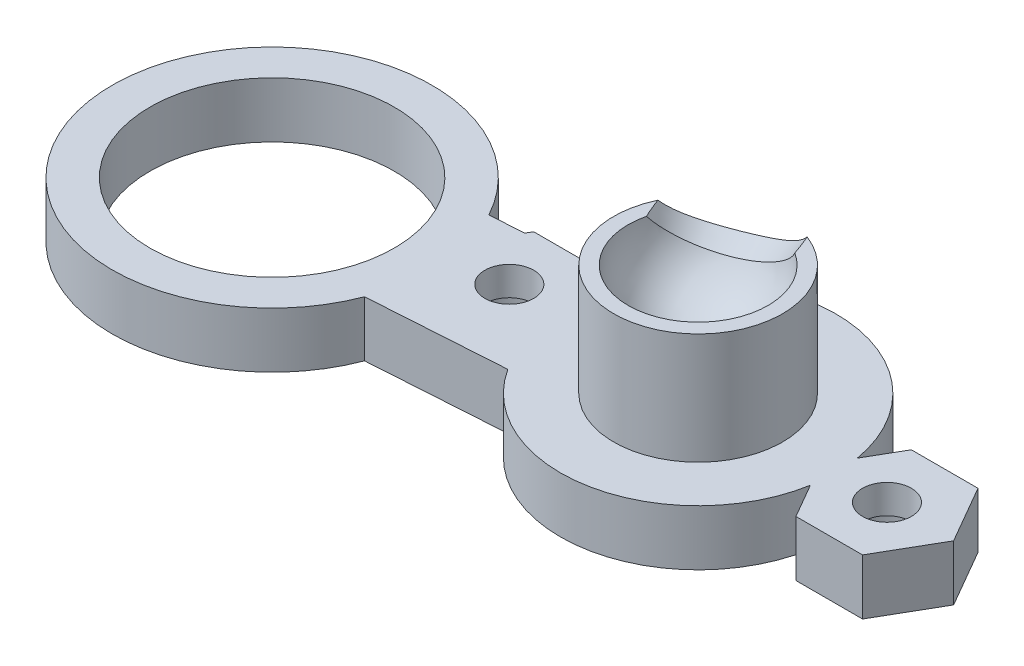
ISO-10303-21;
HEADER;
FILE_DESCRIPTION(('STEP AP214'),'2;1');
FILE_NAME('part.step','',(''),(''),'','','');
FILE_SCHEMA(('AUTOMOTIVE_DESIGN { 1 0 10303 214 1 1 1 1 }'));
ENDSEC;
DATA;
#1=APPLICATION_CONTEXT('core data for automotive mechanical design processes');
#2=APPLICATION_PROTOCOL_DEFINITION('international standard','automotive_design',2000,#1);
#3=PRODUCT_CONTEXT('',#1,'mechanical');
#4=PRODUCT('Part','Part','',(#3));
#5=PRODUCT_RELATED_PRODUCT_CATEGORY('part','',(#4));
#6=PRODUCT_DEFINITION_FORMATION('','',#4);
#7=PRODUCT_DEFINITION_CONTEXT('part definition',#1,'design');
#8=PRODUCT_DEFINITION('design','',#6,#7);
#9=PRODUCT_DEFINITION_SHAPE('','',#8);
#10=(LENGTH_UNIT() NAMED_UNIT(*) SI_UNIT(.MILLI.,.METRE.));
#11=(NAMED_UNIT(*) PLANE_ANGLE_UNIT() SI_UNIT($,.RADIAN.));
#12=(NAMED_UNIT(*) SI_UNIT($,.STERADIAN.) SOLID_ANGLE_UNIT());
#13=UNCERTAINTY_MEASURE_WITH_UNIT(LENGTH_MEASURE(1.E-05),#10,'distance_accuracy_value','');
#14=(GEOMETRIC_REPRESENTATION_CONTEXT(3) GLOBAL_UNCERTAINTY_ASSIGNED_CONTEXT((#13)) GLOBAL_UNIT_ASSIGNED_CONTEXT((#10,
#11,#12)) REPRESENTATION_CONTEXT('',''));
#15=CARTESIAN_POINT('',(0.,0.,0.));
#16=DIRECTION('',(0.,0.,1.));
#17=DIRECTION('',(1.,0.,0.));
#18=AXIS2_PLACEMENT_3D('',#15,#16,#17);
#19=CARTESIAN_POINT('',(-64.7916512459885,-108.75,30.));
#20=DIRECTION('',(0.,1.,0.));
#21=DIRECTION('',(0.,0.,1.));
#22=AXIS2_PLACEMENT_3D('',#19,#20,#21);
#23=CYLINDRICAL_SURFACE('',#22,1.1);
#24=CARTESIAN_POINT('',(-64.7916512459885,-106.,30.));
#25=DIRECTION('',(0.,-1.,0.));
#26=DIRECTION('',(0.,0.,-1.));
#27=AXIS2_PLACEMENT_3D('',#24,#25,#26);
#28=CIRCLE('',#27,1.1);
#29=CARTESIAN_POINT('',(-64.7916512459885,-106.,28.9));
#30=VERTEX_POINT('',#29);
#31=EDGE_CURVE('E203',#30,#30,#28,.F.);
#32=ORIENTED_EDGE('',*,*,#31,.T.);
#33=EDGE_LOOP('',(#32));
#34=FACE_BOUND('',#33,.T.);
#35=CARTESIAN_POINT('',(-64.7916512459885,-107.3,30.));
#36=DIRECTION('',(0.,-1.,0.));
#37=DIRECTION('',(0.,0.,-1.));
#38=AXIS2_PLACEMENT_3D('',#35,#36,#37);
#39=CIRCLE('',#38,1.1);
#40=CARTESIAN_POINT('',(-64.7916512459885,-107.3,28.9));
#41=VERTEX_POINT('',#40);
#42=EDGE_CURVE('E210',#41,#41,#39,.T.);
#43=ORIENTED_EDGE('',*,*,#42,.T.);
#44=EDGE_LOOP('',(#43));
#45=FACE_BOUND('',#44,.T.);
#46=ADVANCED_FACE('F41',(#34,#45),#23,.F.);
#47=CARTESIAN_POINT('',(-47.7916512459885,-108.75,30.));
#48=DIRECTION('',(0.,1.,0.));
#49=DIRECTION('',(0.,0.,1.));
#50=AXIS2_PLACEMENT_3D('',#47,#48,#49);
#51=CYLINDRICAL_SURFACE('',#50,1.1);
#52=CARTESIAN_POINT('',(-47.7916512459885,-106.,30.));
#53=DIRECTION('',(0.,-1.,0.));
#54=DIRECTION('',(0.,0.,-1.));
#55=AXIS2_PLACEMENT_3D('',#52,#53,#54);
#56=CIRCLE('',#55,1.1);
#57=CARTESIAN_POINT('',(-47.7916512459885,-106.,28.9));
#58=VERTEX_POINT('',#57);
#59=EDGE_CURVE('E195',#58,#58,#56,.F.);
#60=ORIENTED_EDGE('',*,*,#59,.T.);
#61=EDGE_LOOP('',(#60));
#62=FACE_BOUND('',#61,.T.);
#63=CARTESIAN_POINT('',(-47.7916512459885,-107.3,30.));
#64=DIRECTION('',(0.,-1.,0.));
#65=DIRECTION('',(0.,0.,-1.));
#66=AXIS2_PLACEMENT_3D('',#63,#64,#65);
#67=CIRCLE('',#66,1.1);
#68=CARTESIAN_POINT('',(-47.7916512459885,-107.3,28.9));
#69=VERTEX_POINT('',#68);
#70=EDGE_CURVE('E200',#69,#69,#67,.T.);
#71=ORIENTED_EDGE('',*,*,#70,.T.);
#72=EDGE_LOOP('',(#71));
#73=FACE_BOUND('',#72,.T.);
#74=ADVANCED_FACE('F346',(#62,#73),#51,.F.);
#75=CARTESIAN_POINT('',(-74.4873857240542,-108.5,28.1833066771346));
#76=DIRECTION('',(0.0652448260218996,0.,0.997869286368396));
#77=DIRECTION('',(0.997869286368396,0.,-0.0652448260218996));
#78=AXIS2_PLACEMENT_3D('',#75,#76,#77);
#79=PLANE('',#78);
#80=DIRECTION('',(0.,1.,0.));
#81=VECTOR('',#80,1.);
#82=CARTESIAN_POINT('',(-67.9561044602363,-108.5,27.7562644627092));
#83=LINE('',#82,#81);
#84=CARTESIAN_POINT('',(-67.9561044602363,-106.,27.7562644627092));
#85=VERTEX_POINT('',#84);
#86=CARTESIAN_POINT('',(-67.9561044602363,-108.5,27.7562644627092));
#87=VERTEX_POINT('',#86);
#88=EDGE_CURVE('E241',#85,#87,#83,.F.);
#89=ORIENTED_EDGE('',*,*,#88,.F.);
#90=DIRECTION('',(0.997869286368396,0.,-0.0652448260218996));
#91=VECTOR('',#90,1.);
#92=CARTESIAN_POINT('',(-74.4873857240542,-106.,28.1833066771346));
#93=LINE('',#92,#91);
#94=CARTESIAN_POINT('',(-66.4389583443347,-106.,27.6570671672978));
#95=VERTEX_POINT('',#94);
#96=EDGE_CURVE('E249',#85,#95,#93,.T.);
#97=ORIENTED_EDGE('',*,*,#96,.T.);
#98=DIRECTION('',(0.,-1.,0.));
#99=VECTOR('',#98,1.);
#100=CARTESIAN_POINT('',(-66.4389583443347,-108.5,27.6570671672978));
#101=LINE('',#100,#99);
#102=CARTESIAN_POINT('',(-66.4389583443347,-108.5,27.6570671672978));
#103=VERTEX_POINT('',#102);
#104=EDGE_CURVE('E184',#95,#103,#101,.T.);
#105=ORIENTED_EDGE('',*,*,#104,.T.);
#106=DIRECTION('',(0.997869286368396,0.,-0.0652448260218996));
#107=VECTOR('',#106,1.);
#108=CARTESIAN_POINT('',(-74.4873857240542,-108.5,28.1833066771346));
#109=LINE('',#108,#107);
#110=EDGE_CURVE('E63',#87,#103,#109,.T.);
#111=ORIENTED_EDGE('',*,*,#110,.F.);
#112=EDGE_LOOP('',(#89,#97,#105,#111));
#113=FACE_BOUND('',#112,.T.);
#114=ADVANCED_FACE('F358',(#113),#79,.F.);
#115=CARTESIAN_POINT('',(-56.0959167679228,-108.5,32.9936078591052));
#116=DIRECTION('',(-0.0652448260218995,0.,-0.997869286368396));
#117=DIRECTION('',(-0.997869286368396,0.,0.0652448260218995));
#118=AXIS2_PLACEMENT_3D('',#115,#116,#117);
#119=PLANE('',#118);
#120=DIRECTION('',(0.,1.,0.));
#121=VECTOR('',#120,1.);
#122=CARTESIAN_POINT('',(-67.5646355041049,-108.5,33.7434801809195));
#123=LINE('',#122,#121);
#124=CARTESIAN_POINT('',(-67.5646355041049,-108.5,33.7434801809195));
#125=VERTEX_POINT('',#124);
#126=CARTESIAN_POINT('',(-67.5646355041049,-106.,33.7434801809195));
#127=VERTEX_POINT('',#126);
#128=EDGE_CURVE('E49',#125,#127,#123,.T.);
#129=ORIENTED_EDGE('',*,*,#128,.F.);
#130=DIRECTION('',(-0.997869286368396,0.,0.0652448260218995));
#131=VECTOR('',#130,1.);
#132=CARTESIAN_POINT('',(-56.0959167679228,-108.5,32.9936078591052));
#133=LINE('',#132,#131);
#134=CARTESIAN_POINT('',(-61.5102197920638,-108.5,33.3476174109229));
#135=VERTEX_POINT('',#134);
#136=EDGE_CURVE('E246',#135,#125,#133,.T.);
#137=ORIENTED_EDGE('',*,*,#136,.F.);
#138=DIRECTION('',(0.,1.,0.));
#139=VECTOR('',#138,1.);
#140=CARTESIAN_POINT('',(-61.5102197920638,-108.5,33.3476174109229));
#141=LINE('',#140,#139);
#142=CARTESIAN_POINT('',(-61.5102197920638,-106.,33.3476174109229));
#143=VERTEX_POINT('',#142);
#144=EDGE_CURVE('E172',#135,#143,#141,.T.);
#145=ORIENTED_EDGE('',*,*,#144,.T.);
#146=DIRECTION('',(-0.997869286368396,0.,0.0652448260218995));
#147=VECTOR('',#146,1.);
#148=CARTESIAN_POINT('',(-56.0959167679228,-106.,32.9936078591052));
#149=LINE('',#148,#147);
#150=EDGE_CURVE('E244',#143,#127,#149,.T.);
#151=ORIENTED_EDGE('',*,*,#150,.T.);
#152=EDGE_LOOP('',(#129,#137,#145,#151));
#153=FACE_BOUND('',#152,.T.);
#154=ADVANCED_FACE('F382',(#153),#119,.F.);
#155=CARTESIAN_POINT('',(-56.2916512459885,-108.5,30.));
#156=DIRECTION('',(0.,1.,0.));
#157=DIRECTION('',(0.,0.,1.));
#158=AXIS2_PLACEMENT_3D('',#155,#156,#157);
#159=CYLINDRICAL_SURFACE('',#158,6.2);
#160=DIRECTION('',(0.,1.,0.));
#161=VECTOR('',#160,1.);
#162=CARTESIAN_POINT('',(-61.9016887481952,-108.5,27.3604016927125));
#163=LINE('',#162,#161);
#164=CARTESIAN_POINT('',(-61.9016887481952,-106.,27.3604016927125));
#165=VERTEX_POINT('',#164);
#166=CARTESIAN_POINT('',(-61.9016887481952,-108.5,27.3604016927125));
#167=VERTEX_POINT('',#166);
#168=EDGE_CURVE('E177',#165,#167,#163,.F.);
#169=ORIENTED_EDGE('',*,*,#168,.F.);
#170=CARTESIAN_POINT('',(-56.2916512459885,-106.,30.));
#171=DIRECTION('',(0.,-1.,0.));
#172=DIRECTION('',(0.,0.,-1.));
#173=AXIS2_PLACEMENT_3D('',#170,#171,#172);
#174=CIRCLE('',#173,6.2);
#175=CARTESIAN_POINT('',(-50.1821802837419,-106.,28.944365327651));
#176=VERTEX_POINT('',#175);
#177=EDGE_CURVE('E322',#165,#176,#174,.T.);
#178=ORIENTED_EDGE('',*,*,#177,.T.);
#179=DIRECTION('',(0.,1.,0.));
#180=VECTOR('',#179,1.);
#181=CARTESIAN_POINT('',(-50.1821802837419,-108.5,28.944365327651));
#182=LINE('',#181,#180);
#183=CARTESIAN_POINT('',(-50.1821802837419,-108.5,28.944365327651));
#184=VERTEX_POINT('',#183);
#185=EDGE_CURVE('E316',#184,#176,#182,.T.);
#186=ORIENTED_EDGE('',*,*,#185,.F.);
#187=CARTESIAN_POINT('',(-56.2916512459885,-108.5,30.));
#188=DIRECTION('',(0.,-1.,0.));
#189=DIRECTION('',(0.,0.,-1.));
#190=AXIS2_PLACEMENT_3D('',#187,#188,#189);
#191=CIRCLE('',#190,6.2);
#192=EDGE_CURVE('E329',#167,#184,#191,.T.);
#193=ORIENTED_EDGE('',*,*,#192,.F.);
#194=EDGE_LOOP('',(#169,#178,#186,#193));
#195=FACE_BOUND('',#194,.T.);
#196=ADVANCED_FACE('F381',(#195),#159,.T.);
#197=ORIENTED_EDGE('',*,*,#144,.F.);
#198=CARTESIAN_POINT('',(-50.1821802837419,-108.5,31.055634672349));
#199=VERTEX_POINT('',#198);
#200=EDGE_CURVE('E328',#199,#135,#191,.T.);
#201=ORIENTED_EDGE('',*,*,#200,.F.);
#202=DIRECTION('',(0.,1.,0.));
#203=VECTOR('',#202,1.);
#204=CARTESIAN_POINT('',(-50.1821802837419,-108.5,31.055634672349));
#205=LINE('',#204,#203);
#206=CARTESIAN_POINT('',(-50.1821802837419,-106.,31.055634672349));
#207=VERTEX_POINT('',#206);
#208=EDGE_CURVE('E321',#207,#199,#205,.F.);
#209=ORIENTED_EDGE('',*,*,#208,.F.);
#210=EDGE_CURVE('E327',#207,#143,#174,.T.);
#211=ORIENTED_EDGE('',*,*,#210,.T.);
#212=EDGE_LOOP('',(#197,#201,#209,#211));
#213=FACE_BOUND('',#212,.T.);
#214=ADVANCED_FACE('F392',(#213),#159,.T.);
#215=CARTESIAN_POINT('',(-63.2916512459885,-108.5,27.4019237886467));
#216=DIRECTION('',(-0.866025403784438,0.,0.500000000000002));
#217=DIRECTION('',(0.500000000000002,0.,0.866025403784438));
#218=AXIS2_PLACEMENT_3D('',#215,#216,#217);
#219=PLANE('',#218);
#220=DIRECTION('',(0.,1.,0.));
#221=VECTOR('',#220,1.);
#222=CARTESIAN_POINT('',(-63.264190219979,-108.5,27.4494876809231));
#223=LINE('',#222,#221);
#224=CARTESIAN_POINT('',(-63.264190219979,-108.5,27.4494876809231));
#225=VERTEX_POINT('',#224);
#226=CARTESIAN_POINT('',(-63.264190219979,-106.,27.4494876809231));
#227=VERTEX_POINT('',#226);
#228=EDGE_CURVE('E255',#225,#227,#223,.T.);
#229=ORIENTED_EDGE('',*,*,#228,.F.);
#230=DIRECTION('',(0.500000000000002,0.,0.866025403784437));
#231=VECTOR('',#230,1.);
#232=CARTESIAN_POINT('',(-63.2916512459885,-108.5,27.4019237886467));
#233=LINE('',#232,#231);
#234=CARTESIAN_POINT('',(-63.2916512459885,-108.5,27.4019237886467));
#235=VERTEX_POINT('',#234);
#236=EDGE_CURVE('E257',#235,#225,#233,.T.);
#237=ORIENTED_EDGE('',*,*,#236,.F.);
#238=DIRECTION('',(0.,1.,0.));
#239=VECTOR('',#238,1.);
#240=CARTESIAN_POINT('',(-63.2916512459885,-108.5,27.4019237886467));
#241=LINE('',#240,#239);
#242=CARTESIAN_POINT('',(-63.2916512459885,-106.,27.4019237886467));
#243=VERTEX_POINT('',#242);
#244=EDGE_CURVE('E270',#235,#243,#241,.T.);
#245=ORIENTED_EDGE('',*,*,#244,.T.);
#246=DIRECTION('',(0.500000000000002,0.,0.866025403784437));
#247=VECTOR('',#246,1.);
#248=CARTESIAN_POINT('',(-63.2916512459885,-106.,27.4019237886467));
#249=LINE('',#248,#247);
#250=EDGE_CURVE('E173',#243,#227,#249,.T.);
#251=ORIENTED_EDGE('',*,*,#250,.T.);
#252=EDGE_LOOP('',(#229,#237,#245,#251));
#253=FACE_BOUND('',#252,.T.);
#254=ADVANCED_FACE('F343',(#253),#219,.F.);
#255=CARTESIAN_POINT('',(-67.7916512459885,-108.5,30.));
#256=DIRECTION('',(0.866025403784439,0.,0.5));
#257=DIRECTION('',(0.5,0.,-0.866025403784439));
#258=AXIS2_PLACEMENT_3D('',#255,#256,#257);
#259=PLANE('',#258);
#260=ORIENTED_EDGE('',*,*,#104,.F.);
#261=DIRECTION('',(0.5,0.,-0.866025403784439));
#262=VECTOR('',#261,1.);
#263=CARTESIAN_POINT('',(-67.7916512459885,-106.,30.));
#264=LINE('',#263,#262);
#265=CARTESIAN_POINT('',(-66.2916512459885,-106.,27.4019237886467));
#266=VERTEX_POINT('',#265);
#267=EDGE_CURVE('E176',#95,#266,#264,.T.);
#268=ORIENTED_EDGE('',*,*,#267,.T.);
#269=DIRECTION('',(0.,1.,0.));
#270=VECTOR('',#269,1.);
#271=CARTESIAN_POINT('',(-66.2916512459885,-108.5,27.4019237886467));
#272=LINE('',#271,#270);
#273=CARTESIAN_POINT('',(-66.2916512459885,-108.5,27.4019237886467));
#274=VERTEX_POINT('',#273);
#275=EDGE_CURVE('E271',#274,#266,#272,.T.);
#276=ORIENTED_EDGE('',*,*,#275,.F.);
#277=DIRECTION('',(0.5,0.,-0.866025403784439));
#278=VECTOR('',#277,1.);
#279=CARTESIAN_POINT('',(-67.7916512459885,-108.5,30.));
#280=LINE('',#279,#278);
#281=EDGE_CURVE('E261',#103,#274,#280,.T.);
#282=ORIENTED_EDGE('',*,*,#281,.F.);
#283=EDGE_LOOP('',(#260,#268,#276,#282));
#284=FACE_BOUND('',#283,.T.);
#285=ADVANCED_FACE('F336',(#284),#259,.F.);
#286=CARTESIAN_POINT('',(-56.2916512459885,-106.02,30.));
#287=DIRECTION('',(0.,1.,0.));
#288=DIRECTION('',(0.,0.,1.));
#289=AXIS2_PLACEMENT_3D('',#286,#287,#288);
#290=CYLINDRICAL_SURFACE('',#289,3.8);
#291=CARTESIAN_POINT('',(-56.2916512459885,-101.,30.));
#292=DIRECTION('',(0.,-1.,0.));
#293=DIRECTION('',(0.,0.,-1.));
#294=AXIS2_PLACEMENT_3D('',#291,#292,#293);
#295=CIRCLE('',#294,3.8);
#296=CARTESIAN_POINT('',(-54.9359840099452,-101.,26.4500469939563));
#297=VERTEX_POINT('',#296);
#298=CARTESIAN_POINT('',(-59.7272686237187,-101.,28.3762594930721));
#299=VERTEX_POINT('',#298);
#300=EDGE_CURVE('E169',#297,#299,#295,.T.);
#301=ORIENTED_EDGE('',*,*,#300,.T.);
#302=CARTESIAN_POINT('',(-59.7273489516052,-100.9998,28.3764294670018));
#303=CARTESIAN_POINT('',(-59.6982439038354,-101.072342110152,28.3147764275957));
#304=CARTESIAN_POINT('',(-59.6660169992389,-101.141737029236,28.2509329767744));
#305=CARTESIAN_POINT('',(-59.5950317568943,-101.2741615165,28.1203337966306));
#306=CARTESIAN_POINT('',(-59.5562732873464,-101.337190956191,28.0535780085605));
#307=CARTESIAN_POINT('',(-59.4718849604281,-101.456886305187,27.9185398759363));
#308=CARTESIAN_POINT('',(-59.4262464655611,-101.513544056817,27.8502557056668));
#309=CARTESIAN_POINT('',(-59.3280102209679,-101.620336946865,27.7136058462189));
#310=CARTESIAN_POINT('',(-59.275413628793,-101.670473167462,27.6452401724701));
#311=CARTESIAN_POINT('',(-59.1697648271259,-101.75869968596,27.5175588846148));
#312=CARTESIAN_POINT('',(-59.1174718743329,-101.797512633648,27.4581126744177));
#313=CARTESIAN_POINT('',(-59.0075446232411,-101.86987515176,27.340982992616));
#314=CARTESIAN_POINT('',(-58.9499108650743,-101.903425253509,27.2832993435411));
#315=CARTESIAN_POINT('',(-58.829588730861,-101.96510164616,27.1705726670172));
#316=CARTESIAN_POINT('',(-58.766908541791,-101.9932364806,27.1155255847316));
#317=CARTESIAN_POINT('',(-58.6367115940562,-102.044024535532,27.0087159270121));
#318=CARTESIAN_POINT('',(-58.5691950527587,-102.066678002182,26.9569532041612));
#319=CARTESIAN_POINT('',(-58.4332338705856,-102.105385136737,26.8598971112717));
#320=CARTESIAN_POINT('',(-58.3650059620865,-102.121713025434,26.8144094242844));
#321=CARTESIAN_POINT('',(-58.2249628739849,-102.149229670343,26.7275239293778));
#322=CARTESIAN_POINT('',(-58.1531463832196,-102.160416532726,26.6861276330284));
#323=CARTESIAN_POINT('',(-58.0064787666214,-102.17756924396,26.6079111196326));
#324=CARTESIAN_POINT('',(-57.9316284349337,-102.183536450003,26.5710897151809));
#325=CARTESIAN_POINT('',(-57.7794638849164,-102.190221249505,26.5023721303998));
#326=CARTESIAN_POINT('',(-57.7021488024539,-102.190936981028,26.4704777008776));
#327=CARTESIAN_POINT('',(-57.4776665150802,-102.185424591192,26.3864625353505));
#328=CARTESIAN_POINT('',(-57.3281235980046,-102.172629334172,26.340818064506));
#329=CARTESIAN_POINT('',(-57.0272428885205,-102.128913957545,26.2686617120777));
#330=CARTESIAN_POINT('',(-56.8759055905311,-102.09799872196,26.2421446792175));
#331=CARTESIAN_POINT('',(-56.5753296224412,-102.018550534102,26.2075776489179));
#332=CARTESIAN_POINT('',(-56.4260981620568,-101.969967626041,26.1995804940757));
#333=CARTESIAN_POINT('',(-56.1342314946182,-101.855858350757,26.2004542237596));
#334=CARTESIAN_POINT('',(-55.9916018695932,-101.790317943255,26.2093391249562));
#335=CARTESIAN_POINT('',(-55.7076755223766,-101.638024621455,26.2422449430599));
#336=CARTESIAN_POINT('',(-55.5670923720734,-101.550154500006,26.2672291116562));
#337=CARTESIAN_POINT('',(-55.3020519967608,-101.356314064967,26.3286057023343));
#338=CARTESIAN_POINT('',(-55.1775647209751,-101.250378363221,26.364976418281));
#339=CARTESIAN_POINT('',(-55.0411277250355,-101.113686188711,26.4115826842518));
#340=CARTESIAN_POINT('',(-55.0195246264958,-101.091350519122,26.4191889526008));
#341=CARTESIAN_POINT('',(-54.9770907720098,-101.046051944822,26.4345497948463));
#342=CARTESIAN_POINT('',(-54.9562592527024,-101.023089701324,26.4423042099967));
#343=CARTESIAN_POINT('',(-54.9358083830805,-100.9998,26.4501140678745));
#344=B_SPLINE_CURVE_WITH_KNOTS('',3,(#302,#303,#304,#305,#306,#307,#308,#309,#310,#311,#312,
#313,#314,#315,#316,#317,#318,#319,#320,#321,#322,#323,#324,#325,#326,#327,#328,#329,#330,#331,
#332,#333,#334,#335,#336,#337,#338,#339,#340,#341,#342,#343),.UNSPECIFIED.,.F.,.F.,(4,2,2,2,2,2,
2,2,2,2,2,2,2,2,2,2,2,2,2,2,4),(0.,0.298502367110101,0.597010758387172,0.895897080679055,
1.19473374252969,1.45893687456312,1.72311331603081,1.98686949351789,2.25061382405024,
2.50111827840571,2.75171493870104,3.00224642058705,3.25286672539202,3.72104449842144,
4.18909613775278,4.65848162776417,5.1282570049278,5.62913773764798,6.12906939821769,
6.22503537633686,6.32090372644182),.UNSPECIFIED.);
#345=EDGE_CURVE('E167',#299,#297,#344,.T.);
#346=ORIENTED_EDGE('',*,*,#345,.T.);
#347=EDGE_LOOP('',(#301,#346));
#348=FACE_BOUND('',#347,.T.);
#349=CARTESIAN_POINT('',(-56.2916512459885,-106.,30.));
#350=DIRECTION('',(0.,-1.,0.));
#351=DIRECTION('',(0.,0.,-1.));
#352=AXIS2_PLACEMENT_3D('',#349,#350,#351);
#353=CIRCLE('',#352,3.8);
#354=CARTESIAN_POINT('',(-56.2916512459885,-106.,26.2));
#355=VERTEX_POINT('',#354);
#356=EDGE_CURVE('E182',#355,#355,#353,.T.);
#357=ORIENTED_EDGE('',*,*,#356,.F.);
#358=EDGE_LOOP('',(#357));
#359=FACE_BOUND('',#358,.T.);
#360=ADVANCED_FACE('F43',(#348,#359),#290,.T.);
#361=CARTESIAN_POINT('',(-56.2916512459885,-101.,30.));
#362=DIRECTION('',(0.,-1.,0.));
#363=DIRECTION('',(0.,0.,-1.));
#364=AXIS2_PLACEMENT_3D('',#361,#362,#363);
#365=PLANE('',#364);
#366=ORIENTED_EDGE('',*,*,#300,.F.);
#367=CARTESIAN_POINT('',(-57.2135245359946,-101.,27.7069210628203));
#368=DIRECTION('',(0.,-1.,0.));
#369=DIRECTION('',(-0.373009193509687,0.,-0.927827646471721));
#370=AXIS2_PLACEMENT_3D('',#367,#368,#369);
#371=ELLIPSE('',#370,5.40311255334577,2.58643522865269);
#372=CARTESIAN_POINT('',(-54.5897018221519,-101.,27.3493645745402));
#373=VERTEX_POINT('',#372);
#374=EDGE_CURVE('E159',#297,#373,#371,.T.);
#375=ORIENTED_EDGE('',*,*,#374,.T.);
#376=CARTESIAN_POINT('',(-56.2916512459885,-101.,30.));
#377=DIRECTION('',(0.,-1.,0.));
#378=DIRECTION('',(0.,0.,-1.));
#379=AXIS2_PLACEMENT_3D('',#376,#377,#378);
#380=CIRCLE('',#379,3.15);
#381=CARTESIAN_POINT('',(-59.3547037914325,-101.,29.2650108137878));
#382=VERTEX_POINT('',#381);
#383=EDGE_CURVE('E170',#373,#382,#380,.T.);
#384=ORIENTED_EDGE('',*,*,#383,.T.);
#385=EDGE_CURVE('E60',#382,#299,#371,.T.);
#386=ORIENTED_EDGE('',*,*,#385,.T.);
#387=EDGE_LOOP('',(#366,#375,#384,#386));
#388=FACE_BOUND('',#387,.T.);
#389=ADVANCED_FACE('F168',(#388),#365,.F.);
#390=CARTESIAN_POINT('',(-56.2916512459885,-108.5,30.));
#391=DIRECTION('',(0.,-1.,0.));
#392=DIRECTION('',(0.,0.,-1.));
#393=AXIS2_PLACEMENT_3D('',#390,#391,#392);
#394=PLANE('',#393);
#395=CARTESIAN_POINT('',(-64.7916512459885,-108.5,30.));
#396=DIRECTION('',(0.,-1.,0.));
#397=DIRECTION('',(0.,0.,-1.));
#398=AXIS2_PLACEMENT_3D('',#395,#396,#397);
#399=CIRCLE('',#398,2.1);
#400=CARTESIAN_POINT('',(-64.7916512459885,-108.5,27.9));
#401=VERTEX_POINT('',#400);
#402=EDGE_CURVE('E207',#401,#401,#399,.F.);
#403=ORIENTED_EDGE('',*,*,#402,.T.);
#404=EDGE_LOOP('',(#403));
#405=FACE_BOUND('',#404,.T.);
#406=CARTESIAN_POINT('',(-47.7916512459885,-108.5,30.));
#407=DIRECTION('',(0.,-1.,0.));
#408=DIRECTION('',(0.,0.,-1.));
#409=AXIS2_PLACEMENT_3D('',#406,#407,#408);
#410=CIRCLE('',#409,2.1);
#411=CARTESIAN_POINT('',(-47.7916512459885,-108.5,27.9));
#412=VERTEX_POINT('',#411);
#413=EDGE_CURVE('E198',#412,#412,#410,.F.);
#414=ORIENTED_EDGE('',*,*,#413,.T.);
#415=EDGE_LOOP('',(#414));
#416=FACE_BOUND('',#415,.T.);
#417=CARTESIAN_POINT('',(-74.2916512459885,-108.5,31.1769145362398));
#418=DIRECTION('',(0.,-1.,0.));
#419=DIRECTION('',(0.,0.,-1.));
#420=AXIS2_PLACEMENT_3D('',#417,#418,#419);
#421=CIRCLE('',#420,5.50000000000001);
#422=CARTESIAN_POINT('',(-74.2916512459885,-108.5,36.6769145362398));
#423=VERTEX_POINT('',#422);
#424=EDGE_CURVE('E191',#423,#423,#421,.F.);
#425=ORIENTED_EDGE('',*,*,#424,.T.);
#426=EDGE_LOOP('',(#425));
#427=FACE_BOUND('',#426,.T.);
#428=CARTESIAN_POINT('',(-74.2916512459885,-108.5,31.1769145362398));
#429=DIRECTION('',(0.,-1.,0.));
#430=DIRECTION('',(0.,0.,-1.));
#431=AXIS2_PLACEMENT_3D('',#428,#429,#430);
#432=CIRCLE('',#431,7.2);
#433=EDGE_CURVE('E238',#125,#87,#432,.T.);
#434=ORIENTED_EDGE('',*,*,#433,.T.);
#435=ORIENTED_EDGE('',*,*,#110,.T.);
#436=ORIENTED_EDGE('',*,*,#281,.T.);
#437=DIRECTION('',(1.,0.,0.));
#438=VECTOR('',#437,1.);
#439=CARTESIAN_POINT('',(-66.2916512459885,-108.5,27.4019237886467));
#440=LINE('',#439,#438);
#441=EDGE_CURVE('E267',#274,#235,#440,.T.);
#442=ORIENTED_EDGE('',*,*,#441,.T.);
#443=ORIENTED_EDGE('',*,*,#236,.T.);
#444=EDGE_CURVE('E248',#225,#167,#109,.T.);
#445=ORIENTED_EDGE('',*,*,#444,.T.);
#446=ORIENTED_EDGE('',*,*,#192,.T.);
#447=DIRECTION('',(0.500000000000001,0.,-0.866025403784438));
#448=VECTOR('',#447,1.);
#449=CARTESIAN_POINT('',(-50.7916512459885,-108.5,30.));
#450=LINE('',#449,#448);
#451=CARTESIAN_POINT('',(-49.2916512459885,-108.5,27.4019237886467));
#452=VERTEX_POINT('',#451);
#453=EDGE_CURVE('E288',#184,#452,#450,.T.);
#454=ORIENTED_EDGE('',*,*,#453,.T.);
#455=DIRECTION('',(1.,0.,0.));
#456=VECTOR('',#455,1.);
#457=CARTESIAN_POINT('',(-49.2916512459885,-108.5,27.4019237886467));
#458=LINE('',#457,#456);
#459=CARTESIAN_POINT('',(-46.2916512459885,-108.5,27.4019237886467));
#460=VERTEX_POINT('',#459);
#461=EDGE_CURVE('E286',#452,#460,#458,.T.);
#462=ORIENTED_EDGE('',*,*,#461,.T.);
#463=DIRECTION('',(0.500000000000001,0.,0.866025403784438));
#464=VECTOR('',#463,1.);
#465=CARTESIAN_POINT('',(-46.2916512459885,-108.5,27.4019237886467));
#466=LINE('',#465,#464);
#467=CARTESIAN_POINT('',(-44.7916512459885,-108.5,30.));
#468=VERTEX_POINT('',#467);
#469=EDGE_CURVE('E276',#460,#468,#466,.T.);
#470=ORIENTED_EDGE('',*,*,#469,.T.);
#471=DIRECTION('',(-0.5,0.,0.866025403784439));
#472=VECTOR('',#471,1.);
#473=CARTESIAN_POINT('',(-44.7916512459885,-108.5,30.));
#474=LINE('',#473,#472);
#475=CARTESIAN_POINT('',(-46.2916512459885,-108.5,32.5980762113533));
#476=VERTEX_POINT('',#475);
#477=EDGE_CURVE('E277',#468,#476,#474,.T.);
#478=ORIENTED_EDGE('',*,*,#477,.T.);
#479=DIRECTION('',(-1.,0.,0.));
#480=VECTOR('',#479,1.);
#481=CARTESIAN_POINT('',(-46.2916512459885,-108.5,32.5980762113533));
#482=LINE('',#481,#480);
#483=CARTESIAN_POINT('',(-49.2916512459885,-108.5,32.5980762113533));
#484=VERTEX_POINT('',#483);
#485=EDGE_CURVE('E281',#476,#484,#482,.T.);
#486=ORIENTED_EDGE('',*,*,#485,.T.);
#487=DIRECTION('',(-0.5,0.,-0.866025403784439));
#488=VECTOR('',#487,1.);
#489=CARTESIAN_POINT('',(-49.2916512459885,-108.5,32.5980762113533));
#490=LINE('',#489,#488);
#491=EDGE_CURVE('E282',#484,#199,#490,.T.);
#492=ORIENTED_EDGE('',*,*,#491,.T.);
#493=ORIENTED_EDGE('',*,*,#200,.T.);
#494=ORIENTED_EDGE('',*,*,#136,.T.);
#495=EDGE_LOOP('',(#434,#435,#436,#442,#443,#445,#446,#454,#462,#470,#478,#486,#492,#493,#494));
#496=FACE_BOUND('',#495,.T.);
#497=ADVANCED_FACE('F215',(#405,#416,#427,#496),#394,.T.);
#498=CARTESIAN_POINT('',(-56.2916512459885,-106.,30.));
#499=DIRECTION('',(0.,-1.,0.));
#500=DIRECTION('',(0.,0.,-1.));
#501=AXIS2_PLACEMENT_3D('',#498,#499,#500);
#502=PLANE('',#501);
#503=ORIENTED_EDGE('',*,*,#31,.F.);
#504=EDGE_LOOP('',(#503));
#505=FACE_BOUND('',#504,.T.);
#506=ORIENTED_EDGE('',*,*,#59,.F.);
#507=EDGE_LOOP('',(#506));
#508=FACE_BOUND('',#507,.T.);
#509=CARTESIAN_POINT('',(-74.2916512459885,-106.,31.1769145362398));
#510=DIRECTION('',(0.,-1.,0.));
#511=DIRECTION('',(0.,0.,-1.));
#512=AXIS2_PLACEMENT_3D('',#509,#510,#511);
#513=CIRCLE('',#512,5.50000000000001);
#514=CARTESIAN_POINT('',(-74.2916512459885,-106.,36.6769145362398));
#515=VERTEX_POINT('',#514);
#516=EDGE_CURVE('E186',#515,#515,#513,.F.);
#517=ORIENTED_EDGE('',*,*,#516,.F.);
#518=EDGE_LOOP('',(#517));
#519=FACE_BOUND('',#518,.T.);
#520=ORIENTED_EDGE('',*,*,#96,.F.);
#521=CARTESIAN_POINT('',(-74.2916512459885,-106.,31.1769145362398));
#522=DIRECTION('',(0.,-1.,0.));
#523=DIRECTION('',(0.,0.,-1.));
#524=AXIS2_PLACEMENT_3D('',#521,#522,#523);
#525=CIRCLE('',#524,7.2);
#526=EDGE_CURVE('E240',#127,#85,#525,.T.);
#527=ORIENTED_EDGE('',*,*,#526,.F.);
#528=ORIENTED_EDGE('',*,*,#150,.F.);
#529=ORIENTED_EDGE('',*,*,#210,.F.);
#530=DIRECTION('',(-0.5,0.,-0.866025403784439));
#531=VECTOR('',#530,1.);
#532=CARTESIAN_POINT('',(-49.2916512459885,-106.,32.5980762113533));
#533=LINE('',#532,#531);
#534=CARTESIAN_POINT('',(-49.2916512459885,-106.,32.5980762113533));
#535=VERTEX_POINT('',#534);
#536=EDGE_CURVE('E299',#535,#207,#533,.T.);
#537=ORIENTED_EDGE('',*,*,#536,.F.);
#538=DIRECTION('',(-1.,0.,0.));
#539=VECTOR('',#538,1.);
#540=CARTESIAN_POINT('',(-46.2916512459885,-106.,32.5980762113533));
#541=LINE('',#540,#539);
#542=CARTESIAN_POINT('',(-46.2916512459885,-106.,32.5980762113533));
#543=VERTEX_POINT('',#542);
#544=EDGE_CURVE('E300',#543,#535,#541,.T.);
#545=ORIENTED_EDGE('',*,*,#544,.F.);
#546=DIRECTION('',(-0.5,0.,0.866025403784439));
#547=VECTOR('',#546,1.);
#548=CARTESIAN_POINT('',(-44.7916512459885,-106.,30.));
#549=LINE('',#548,#547);
#550=CARTESIAN_POINT('',(-44.7916512459885,-106.,30.));
#551=VERTEX_POINT('',#550);
#552=EDGE_CURVE('E294',#551,#543,#549,.T.);
#553=ORIENTED_EDGE('',*,*,#552,.F.);
#554=DIRECTION('',(0.500000000000001,0.,0.866025403784438));
#555=VECTOR('',#554,1.);
#556=CARTESIAN_POINT('',(-46.2916512459885,-106.,27.4019237886467));
#557=LINE('',#556,#555);
#558=CARTESIAN_POINT('',(-46.2916512459885,-106.,27.4019237886467));
#559=VERTEX_POINT('',#558);
#560=EDGE_CURVE('E279',#559,#551,#557,.T.);
#561=ORIENTED_EDGE('',*,*,#560,.F.);
#562=DIRECTION('',(1.,0.,0.));
#563=VECTOR('',#562,1.);
#564=CARTESIAN_POINT('',(-49.2916512459885,-106.,27.4019237886467));
#565=LINE('',#564,#563);
#566=CARTESIAN_POINT('',(-49.2916512459885,-106.,27.4019237886467));
#567=VERTEX_POINT('',#566);
#568=EDGE_CURVE('E283',#567,#559,#565,.T.);
#569=ORIENTED_EDGE('',*,*,#568,.F.);
#570=DIRECTION('',(0.500000000000001,0.,-0.866025403784438));
#571=VECTOR('',#570,1.);
#572=CARTESIAN_POINT('',(-50.7916512459885,-106.,30.));
#573=LINE('',#572,#571);
#574=EDGE_CURVE('E305',#176,#567,#573,.T.);
#575=ORIENTED_EDGE('',*,*,#574,.F.);
#576=ORIENTED_EDGE('',*,*,#177,.F.);
#577=EDGE_CURVE('E251',#227,#165,#93,.T.);
#578=ORIENTED_EDGE('',*,*,#577,.F.);
#579=ORIENTED_EDGE('',*,*,#250,.F.);
#580=DIRECTION('',(1.,0.,0.));
#581=VECTOR('',#580,1.);
#582=CARTESIAN_POINT('',(-66.2916512459885,-106.,27.4019237886467));
#583=LINE('',#582,#581);
#584=EDGE_CURVE('E264',#266,#243,#583,.T.);
#585=ORIENTED_EDGE('',*,*,#584,.F.);
#586=ORIENTED_EDGE('',*,*,#267,.F.);
#587=EDGE_LOOP('',(#520,#527,#528,#529,#537,#545,#553,#561,#569,#575,#576,#578,#579,#585,#586));
#588=FACE_BOUND('',#587,.T.);
#589=ORIENTED_EDGE('',*,*,#356,.T.);
#590=EDGE_LOOP('',(#589));
#591=FACE_BOUND('',#590,.T.);
#592=ADVANCED_FACE('F331',(#505,#508,#519,#588,#591),#502,.F.);
#593=CARTESIAN_POINT('',(-49.2916512459885,-108.5,32.5980762113533));
#594=DIRECTION('',(0.866025403784439,0.,-0.5));
#595=DIRECTION('',(-0.5,0.,-0.866025403784439));
#596=AXIS2_PLACEMENT_3D('',#593,#594,#595);
#597=PLANE('',#596);
#598=ORIENTED_EDGE('',*,*,#536,.T.);
#599=ORIENTED_EDGE('',*,*,#208,.T.);
#600=ORIENTED_EDGE('',*,*,#491,.F.);
#601=DIRECTION('',(0.,1.,0.));
#602=VECTOR('',#601,1.);
#603=CARTESIAN_POINT('',(-49.2916512459885,-108.5,32.5980762113533));
#604=LINE('',#603,#602);
#605=EDGE_CURVE('E309',#484,#535,#604,.T.);
#606=ORIENTED_EDGE('',*,*,#605,.T.);
#607=EDGE_LOOP('',(#598,#599,#600,#606));
#608=FACE_BOUND('',#607,.T.);
#609=ADVANCED_FACE('F403',(#608),#597,.F.);
#610=CARTESIAN_POINT('',(-50.7916512459885,-108.5,30.));
#611=DIRECTION('',(0.866025403784438,0.,0.500000000000001));
#612=DIRECTION('',(0.500000000000001,0.,-0.866025403784438));
#613=AXIS2_PLACEMENT_3D('',#610,#611,#612);
#614=PLANE('',#613);
#615=ORIENTED_EDGE('',*,*,#453,.F.);
#616=ORIENTED_EDGE('',*,*,#185,.T.);
#617=ORIENTED_EDGE('',*,*,#574,.T.);
#618=DIRECTION('',(0.,1.,0.));
#619=VECTOR('',#618,1.);
#620=CARTESIAN_POINT('',(-49.2916512459885,-108.5,27.4019237886467));
#621=LINE('',#620,#619);
#622=EDGE_CURVE('E310',#452,#567,#621,.T.);
#623=ORIENTED_EDGE('',*,*,#622,.F.);
#624=EDGE_LOOP('',(#615,#616,#617,#623));
#625=FACE_BOUND('',#624,.T.);
#626=ADVANCED_FACE('F402',(#625),#614,.F.);
#627=CARTESIAN_POINT('',(-46.2916512459885,-108.5,27.4019237886467));
#628=DIRECTION('',(-0.866025403784438,0.,0.500000000000001));
#629=DIRECTION('',(0.500000000000001,0.,0.866025403784438));
#630=AXIS2_PLACEMENT_3D('',#627,#628,#629);
#631=PLANE('',#630);
#632=ORIENTED_EDGE('',*,*,#560,.T.);
#633=DIRECTION('',(0.,1.,0.));
#634=VECTOR('',#633,1.);
#635=CARTESIAN_POINT('',(-44.7916512459885,-108.5,30.));
#636=LINE('',#635,#634);
#637=EDGE_CURVE('E317',#468,#551,#636,.T.);
#638=ORIENTED_EDGE('',*,*,#637,.F.);
#639=ORIENTED_EDGE('',*,*,#469,.F.);
#640=DIRECTION('',(0.,1.,0.));
#641=VECTOR('',#640,1.);
#642=CARTESIAN_POINT('',(-46.2916512459885,-108.5,27.4019237886467));
#643=LINE('',#642,#641);
#644=EDGE_CURVE('E292',#460,#559,#643,.T.);
#645=ORIENTED_EDGE('',*,*,#644,.T.);
#646=EDGE_LOOP('',(#632,#638,#639,#645));
#647=FACE_BOUND('',#646,.T.);
#648=ADVANCED_FACE('F404',(#647),#631,.F.);
#649=CARTESIAN_POINT('',(-44.7916512459885,-108.5,30.));
#650=DIRECTION('',(-0.866025403784439,0.,-0.5));
#651=DIRECTION('',(-0.5,0.,0.866025403784439));
#652=AXIS2_PLACEMENT_3D('',#649,#650,#651);
#653=PLANE('',#652);
#654=ORIENTED_EDGE('',*,*,#552,.T.);
#655=DIRECTION('',(0.,1.,0.));
#656=VECTOR('',#655,1.);
#657=CARTESIAN_POINT('',(-46.2916512459885,-108.5,32.5980762113533));
#658=LINE('',#657,#656);
#659=EDGE_CURVE('E312',#476,#543,#658,.T.);
#660=ORIENTED_EDGE('',*,*,#659,.F.);
#661=ORIENTED_EDGE('',*,*,#477,.F.);
#662=ORIENTED_EDGE('',*,*,#637,.T.);
#663=EDGE_LOOP('',(#654,#660,#661,#662));
#664=FACE_BOUND('',#663,.T.);
#665=ADVANCED_FACE('F415',(#664),#653,.F.);
#666=CARTESIAN_POINT('',(-46.2916512459885,-108.5,32.5980762113533));
#667=DIRECTION('',(0.,0.,-1.));
#668=DIRECTION('',(-1.,0.,0.));
#669=AXIS2_PLACEMENT_3D('',#666,#667,#668);
#670=PLANE('',#669);
#671=ORIENTED_EDGE('',*,*,#544,.T.);
#672=ORIENTED_EDGE('',*,*,#605,.F.);
#673=ORIENTED_EDGE('',*,*,#485,.F.);
#674=ORIENTED_EDGE('',*,*,#659,.T.);
#675=EDGE_LOOP('',(#671,#672,#673,#674));
#676=FACE_BOUND('',#675,.T.);
#677=ADVANCED_FACE('F399',(#676),#670,.F.);
#678=CARTESIAN_POINT('',(-49.2916512459885,-108.5,27.4019237886467));
#679=DIRECTION('',(0.,0.,1.));
#680=DIRECTION('',(1.,0.,0.));
#681=AXIS2_PLACEMENT_3D('',#678,#679,#680);
#682=PLANE('',#681);
#683=ORIENTED_EDGE('',*,*,#568,.T.);
#684=ORIENTED_EDGE('',*,*,#644,.F.);
#685=ORIENTED_EDGE('',*,*,#461,.F.);
#686=ORIENTED_EDGE('',*,*,#622,.T.);
#687=EDGE_LOOP('',(#683,#684,#685,#686));
#688=FACE_BOUND('',#687,.T.);
#689=ADVANCED_FACE('F387',(#688),#682,.F.);
#690=CARTESIAN_POINT('',(-66.2916512459885,-108.5,27.4019237886467));
#691=DIRECTION('',(0.,0.,1.));
#692=DIRECTION('',(1.,0.,0.));
#693=AXIS2_PLACEMENT_3D('',#690,#691,#692);
#694=PLANE('',#693);
#695=ORIENTED_EDGE('',*,*,#584,.T.);
#696=ORIENTED_EDGE('',*,*,#244,.F.);
#697=ORIENTED_EDGE('',*,*,#441,.F.);
#698=ORIENTED_EDGE('',*,*,#275,.T.);
#699=EDGE_LOOP('',(#695,#696,#697,#698));
#700=FACE_BOUND('',#699,.T.);
#701=ADVANCED_FACE('F390',(#700),#694,.F.);
#702=CARTESIAN_POINT('',(-56.2916512459885,-101.,30.));
#703=DIRECTION('',(0.,0.,-1.));
#704=DIRECTION('',(-1.,0.,0.));
#705=AXIS2_PLACEMENT_3D('',#702,#703,#704);
#706=SPHERICAL_SURFACE('',#705,3.15);
#707=ORIENTED_EDGE('',*,*,#383,.F.);
#708=CARTESIAN_POINT('',(-56.7749951553088,-100.17230473673,28.7977244271074));
#709=DIRECTION('',(0.314352663124664,-0.538308656109163,0.781924672807028));
#710=DIRECTION('',(0.,-0.823680084758126,-0.567054775108055));
#711=AXIS2_PLACEMENT_3D('',#708,#709,#710);
#712=CIRCLE('',#711,2.74924219800813);
#713=EDGE_CURVE('E11',#373,#382,#712,.F.);
#714=ORIENTED_EDGE('',*,*,#713,.T.);
#715=EDGE_LOOP('',(#707,#714));
#716=FACE_BOUND('',#715,.T.);
#717=ADVANCED_FACE('F175',(#716),#706,.F.);
#718=ORIENTED_EDGE('',*,*,#577,.T.);
#719=ORIENTED_EDGE('',*,*,#168,.T.);
#720=ORIENTED_EDGE('',*,*,#444,.F.);
#721=ORIENTED_EDGE('',*,*,#228,.T.);
#722=EDGE_LOOP('',(#718,#719,#720,#721));
#723=FACE_BOUND('',#722,.T.);
#724=ADVANCED_FACE('F376',(#723),#79,.F.);
#725=CARTESIAN_POINT('',(-74.2916512459885,-108.5,31.1769145362398));
#726=DIRECTION('',(0.,1.,0.));
#727=DIRECTION('',(0.,0.,1.));
#728=AXIS2_PLACEMENT_3D('',#725,#726,#727);
#729=CYLINDRICAL_SURFACE('',#728,7.2);
#730=ORIENTED_EDGE('',*,*,#526,.T.);
#731=ORIENTED_EDGE('',*,*,#88,.T.);
#732=ORIENTED_EDGE('',*,*,#433,.F.);
#733=ORIENTED_EDGE('',*,*,#128,.T.);
#734=EDGE_LOOP('',(#730,#731,#732,#733));
#735=FACE_BOUND('',#734,.T.);
#736=ADVANCED_FACE('F375',(#735),#729,.T.);
#737=CARTESIAN_POINT('',(-74.2916512459885,-108.6,31.1769145362398));
#738=DIRECTION('',(0.,1.,0.));
#739=DIRECTION('',(0.,0.,1.));
#740=AXIS2_PLACEMENT_3D('',#737,#738,#739);
#741=CYLINDRICAL_SURFACE('',#740,5.50000000000001);
#742=CARTESIAN_POINT('',(-74.2916512459885,-108.5,36.6769145362398));
#743=CARTESIAN_POINT('',(-74.2916512459885,-108.473958333333,36.6769145362398));
#744=CARTESIAN_POINT('',(-74.2916512459885,-108.447916666667,36.6769145362398));
#745=CARTESIAN_POINT('',(-74.2916512459885,-108.395833333333,36.6769145362398));
#746=CARTESIAN_POINT('',(-74.2916512459885,-108.369791666667,36.6769145362398));
#747=CARTESIAN_POINT('',(-74.2916512459885,-108.317708333333,36.6769145362398));
#748=CARTESIAN_POINT('',(-74.2916512459885,-108.291666666667,36.6769145362398));
#749=CARTESIAN_POINT('',(-74.2916512459885,-108.239583333333,36.6769145362398));
#750=CARTESIAN_POINT('',(-74.2916512459885,-108.213541666667,36.6769145362398));
#751=CARTESIAN_POINT('',(-74.2916512459885,-108.161458333333,36.6769145362398));
#752=CARTESIAN_POINT('',(-74.2916512459885,-108.135416666667,36.6769145362398));
#753=CARTESIAN_POINT('',(-74.2916512459885,-108.083333333333,36.6769145362398));
#754=CARTESIAN_POINT('',(-74.2916512459885,-108.057291666667,36.6769145362398));
#755=CARTESIAN_POINT('',(-74.2916512459885,-108.005208333333,36.6769145362398));
#756=CARTESIAN_POINT('',(-74.2916512459885,-107.979166666667,36.6769145362398));
#757=CARTESIAN_POINT('',(-74.2916512459885,-107.927083333333,36.6769145362398));
#758=CARTESIAN_POINT('',(-74.2916512459885,-107.901041666667,36.6769145362398));
#759=CARTESIAN_POINT('',(-74.2916512459885,-107.848958333333,36.6769145362398));
#760=CARTESIAN_POINT('',(-74.2916512459885,-107.822916666667,36.6769145362398));
#761=CARTESIAN_POINT('',(-74.2916512459885,-107.770833333333,36.6769145362398));
#762=CARTESIAN_POINT('',(-74.2916512459885,-107.744791666667,36.6769145362398));
#763=CARTESIAN_POINT('',(-74.2916512459885,-107.692708333333,36.6769145362398));
#764=CARTESIAN_POINT('',(-74.2916512459885,-107.666666666667,36.6769145362398));
#765=CARTESIAN_POINT('',(-74.2916512459885,-107.614583333333,36.6769145362398));
#766=CARTESIAN_POINT('',(-74.2916512459885,-107.588541666667,36.6769145362398));
#767=CARTESIAN_POINT('',(-74.2916512459885,-107.536458333333,36.6769145362398));
#768=CARTESIAN_POINT('',(-74.2916512459885,-107.510416666667,36.6769145362398));
#769=CARTESIAN_POINT('',(-74.2916512459885,-107.458333333333,36.6769145362398));
#770=CARTESIAN_POINT('',(-74.2916512459885,-107.432291666667,36.6769145362398));
#771=CARTESIAN_POINT('',(-74.2916512459885,-107.380208333333,36.6769145362398));
#772=CARTESIAN_POINT('',(-74.2916512459885,-107.354166666667,36.6769145362398));
#773=CARTESIAN_POINT('',(-74.2916512459885,-107.302083333333,36.6769145362398));
#774=CARTESIAN_POINT('',(-74.2916512459885,-107.276041666667,36.6769145362398));
#775=CARTESIAN_POINT('',(-74.2916512459885,-107.223958333333,36.6769145362398));
#776=CARTESIAN_POINT('',(-74.2916512459885,-107.197916666667,36.6769145362398));
#777=CARTESIAN_POINT('',(-74.2916512459885,-107.145833333333,36.6769145362398));
#778=CARTESIAN_POINT('',(-74.2916512459885,-107.119791666667,36.6769145362398));
#779=CARTESIAN_POINT('',(-74.2916512459885,-107.067708333333,36.6769145362398));
#780=CARTESIAN_POINT('',(-74.2916512459885,-107.041666666667,36.6769145362398));
#781=CARTESIAN_POINT('',(-74.2916512459885,-106.989583333333,36.6769145362398));
#782=CARTESIAN_POINT('',(-74.2916512459885,-106.963541666667,36.6769145362398));
#783=CARTESIAN_POINT('',(-74.2916512459885,-106.911458333333,36.6769145362398));
#784=CARTESIAN_POINT('',(-74.2916512459885,-106.885416666667,36.6769145362398));
#785=CARTESIAN_POINT('',(-74.2916512459885,-106.833333333333,36.6769145362398));
#786=CARTESIAN_POINT('',(-74.2916512459885,-106.807291666667,36.6769145362398));
#787=CARTESIAN_POINT('',(-74.2916512459885,-106.755208333333,36.6769145362398));
#788=CARTESIAN_POINT('',(-74.2916512459885,-106.729166666667,36.6769145362398));
#789=CARTESIAN_POINT('',(-74.2916512459885,-106.677083333333,36.6769145362398));
#790=CARTESIAN_POINT('',(-74.2916512459885,-106.651041666667,36.6769145362398));
#791=CARTESIAN_POINT('',(-74.2916512459885,-106.598958333333,36.6769145362398));
#792=CARTESIAN_POINT('',(-74.2916512459885,-106.572916666667,36.6769145362398));
#793=CARTESIAN_POINT('',(-74.2916512459885,-106.520833333333,36.6769145362398));
#794=CARTESIAN_POINT('',(-74.2916512459885,-106.494791666667,36.6769145362398));
#795=CARTESIAN_POINT('',(-74.2916512459885,-106.442708333333,36.6769145362398));
#796=CARTESIAN_POINT('',(-74.2916512459885,-106.416666666667,36.6769145362398));
#797=CARTESIAN_POINT('',(-74.2916512459885,-106.364583333333,36.6769145362398));
#798=CARTESIAN_POINT('',(-74.2916512459885,-106.338541666667,36.6769145362398));
#799=CARTESIAN_POINT('',(-74.2916512459885,-106.286458333333,36.6769145362398));
#800=CARTESIAN_POINT('',(-74.2916512459885,-106.260416666667,36.6769145362398));
#801=CARTESIAN_POINT('',(-74.2916512459885,-106.208333333333,36.6769145362398));
#802=CARTESIAN_POINT('',(-74.2916512459885,-106.182291666667,36.6769145362398));
#803=CARTESIAN_POINT('',(-74.2916512459885,-106.130208333333,36.6769145362398));
#804=CARTESIAN_POINT('',(-74.2916512459885,-106.104166666667,36.6769145362398));
#805=CARTESIAN_POINT('',(-74.2916512459885,-106.052083333333,36.6769145362398));
#806=CARTESIAN_POINT('',(-74.2916512459885,-106.026041666667,36.6769145362398));
#807=CARTESIAN_POINT('',(-74.2916512459885,-106.,36.6769145362398));
#808=B_SPLINE_CURVE_WITH_KNOTS('',3,(#742,#743,#744,#745,#746,#747,#748,#749,#750,#751,#752,
#753,#754,#755,#756,#757,#758,#759,#760,#761,#762,#763,#764,#765,#766,#767,#768,#769,#770,#771,
#772,#773,#774,#775,#776,#777,#778,#779,#780,#781,#782,#783,#784,#785,#786,#787,#788,#789,#790,
#791,#792,#793,#794,#795,#796,#797,#798,#799,#800,#801,#802,#803,#804,#805,#806,#807),
.UNSPECIFIED.,.F.,.F.,(4,2,2,2,2,2,2,2,2,2,2,2,2,2,2,2,2,2,2,2,2,2,2,2,2,2,2,2,2,2,2,2,4),(0.,
0.0781250000000122,0.156250000000011,0.234375000000009,0.312500000000007,0.390625000000006,
0.468750000000004,0.546875000000002,0.625000000000001,0.703125000000013,0.781250000000011,
0.859375000000009,0.937500000000008,1.01562500000001,1.09375,1.171875,1.25,1.32812500000001,
1.40625000000001,1.48437500000001,1.56250000000001,1.64062500000001,1.71875,1.796875,1.875,
1.95312500000001,2.03125000000001,2.10937500000001,2.18750000000001,2.26562500000001,
2.34375000000001,2.421875,2.5),.UNSPECIFIED.);
#809=EDGE_CURVE('BSEAM370',#423,#515,#808,.T.);
#810=ORIENTED_EDGE('',*,*,#424,.F.);
#811=ORIENTED_EDGE('',*,*,#516,.T.);
#812=ORIENTED_EDGE('',*,*,#809,.T.);
#813=ORIENTED_EDGE('',*,*,#809,.F.);
#814=EDGE_LOOP('',(#810,#812,#811,#813));
#815=FACE_BOUND('',#814,.T.);
#816=ADVANCED_FACE('F370',(#815),#741,.F.);
#817=CARTESIAN_POINT('',(-47.7916512459885,-108.75,30.));
#818=DIRECTION('',(0.,1.,0.));
#819=DIRECTION('',(0.,0.,1.));
#820=AXIS2_PLACEMENT_3D('',#817,#818,#819);
#821=CYLINDRICAL_SURFACE('',#820,2.1);
#822=ORIENTED_EDGE('',*,*,#413,.F.);
#823=EDGE_LOOP('',(#822));
#824=FACE_BOUND('',#823,.T.);
#825=CARTESIAN_POINT('',(-47.7916512459885,-107.3,30.));
#826=DIRECTION('',(0.,-1.,0.));
#827=DIRECTION('',(0.,0.,-1.));
#828=AXIS2_PLACEMENT_3D('',#825,#826,#827);
#829=CIRCLE('',#828,2.1);
#830=CARTESIAN_POINT('',(-47.7916512459885,-107.3,27.9));
#831=VERTEX_POINT('',#830);
#832=EDGE_CURVE('E197',#831,#831,#829,.T.);
#833=ORIENTED_EDGE('',*,*,#832,.F.);
#834=EDGE_LOOP('',(#833));
#835=FACE_BOUND('',#834,.T.);
#836=ADVANCED_FACE('F364',(#824,#835),#821,.F.);
#837=CARTESIAN_POINT('',(-47.7916512459885,-107.3,30.));
#838=DIRECTION('',(0.,-1.,0.));
#839=DIRECTION('',(0.,0.,-1.));
#840=AXIS2_PLACEMENT_3D('',#837,#838,#839);
#841=PLANE('',#840);
#842=ORIENTED_EDGE('',*,*,#70,.F.);
#843=EDGE_LOOP('',(#842));
#844=FACE_BOUND('',#843,.T.);
#845=ORIENTED_EDGE('',*,*,#832,.T.);
#846=EDGE_LOOP('',(#845));
#847=FACE_BOUND('',#846,.T.);
#848=ADVANCED_FACE('F217',(#844,#847),#841,.T.);
#849=CARTESIAN_POINT('',(-64.7916512459885,-108.75,30.));
#850=DIRECTION('',(0.,1.,0.));
#851=DIRECTION('',(0.,0.,1.));
#852=AXIS2_PLACEMENT_3D('',#849,#850,#851);
#853=CYLINDRICAL_SURFACE('',#852,2.1);
#854=ORIENTED_EDGE('',*,*,#402,.F.);
#855=EDGE_LOOP('',(#854));
#856=FACE_BOUND('',#855,.T.);
#857=CARTESIAN_POINT('',(-64.7916512459885,-107.3,30.));
#858=DIRECTION('',(0.,-1.,0.));
#859=DIRECTION('',(0.,0.,-1.));
#860=AXIS2_PLACEMENT_3D('',#857,#858,#859);
#861=CIRCLE('',#860,2.1);
#862=CARTESIAN_POINT('',(-64.7916512459885,-107.3,27.9));
#863=VERTEX_POINT('',#862);
#864=EDGE_CURVE('E209',#863,#863,#861,.T.);
#865=ORIENTED_EDGE('',*,*,#864,.F.);
#866=EDGE_LOOP('',(#865));
#867=FACE_BOUND('',#866,.T.);
#868=ADVANCED_FACE('F218',(#856,#867),#853,.F.);
#869=CARTESIAN_POINT('',(-64.7916512459885,-107.3,30.));
#870=DIRECTION('',(0.,-1.,0.));
#871=DIRECTION('',(0.,0.,-1.));
#872=AXIS2_PLACEMENT_3D('',#869,#870,#871);
#873=PLANE('',#872);
#874=ORIENTED_EDGE('',*,*,#42,.F.);
#875=EDGE_LOOP('',(#874));
#876=FACE_BOUND('',#875,.T.);
#877=ORIENTED_EDGE('',*,*,#864,.T.);
#878=EDGE_LOOP('',(#877));
#879=FACE_BOUND('',#878,.T.);
#880=ADVANCED_FACE('F219',(#876,#879),#873,.T.);
#881=CARTESIAN_POINT('',(-56.2916512459885,-101.,30.));
#882=DIRECTION('',(-0.314352663124664,0.538308656109163,-0.781924672807028));
#883=DIRECTION('',(0.,0.823680084758126,0.567054775108055));
#884=AXIS2_PLACEMENT_3D('',#881,#882,#883);
#885=CONICAL_SURFACE('',#884,2.30000000000002,0.284261523704202);
#886=ORIENTED_EDGE('',*,*,#385,.F.);
#887=ORIENTED_EDGE('',*,*,#713,.F.);
#888=ORIENTED_EDGE('',*,*,#374,.F.);
#889=ORIENTED_EDGE('',*,*,#345,.F.);
#890=EDGE_LOOP('',(#886,#887,#888,#889));
#891=FACE_BOUND('',#890,.T.);
#892=ADVANCED_FACE('F158',(#891),#885,.F.);
#893=CLOSED_SHELL('',(#46,#74,#114,#154,#196,#214,#254,#285,#360,#389,#497,#592,#609,#626,#648,
#665,#677,#689,#701,#717,#724,#736,#816,#836,#848,#868,#880,#892));
#894=MANIFOLD_SOLID_BREP('B2',#893);
#895=ADVANCED_BREP_SHAPE_REPRESENTATION('',(#18,#894),#14);
#896=SHAPE_DEFINITION_REPRESENTATION(#9,#895);
ENDSEC;
END-ISO-10303-21;
